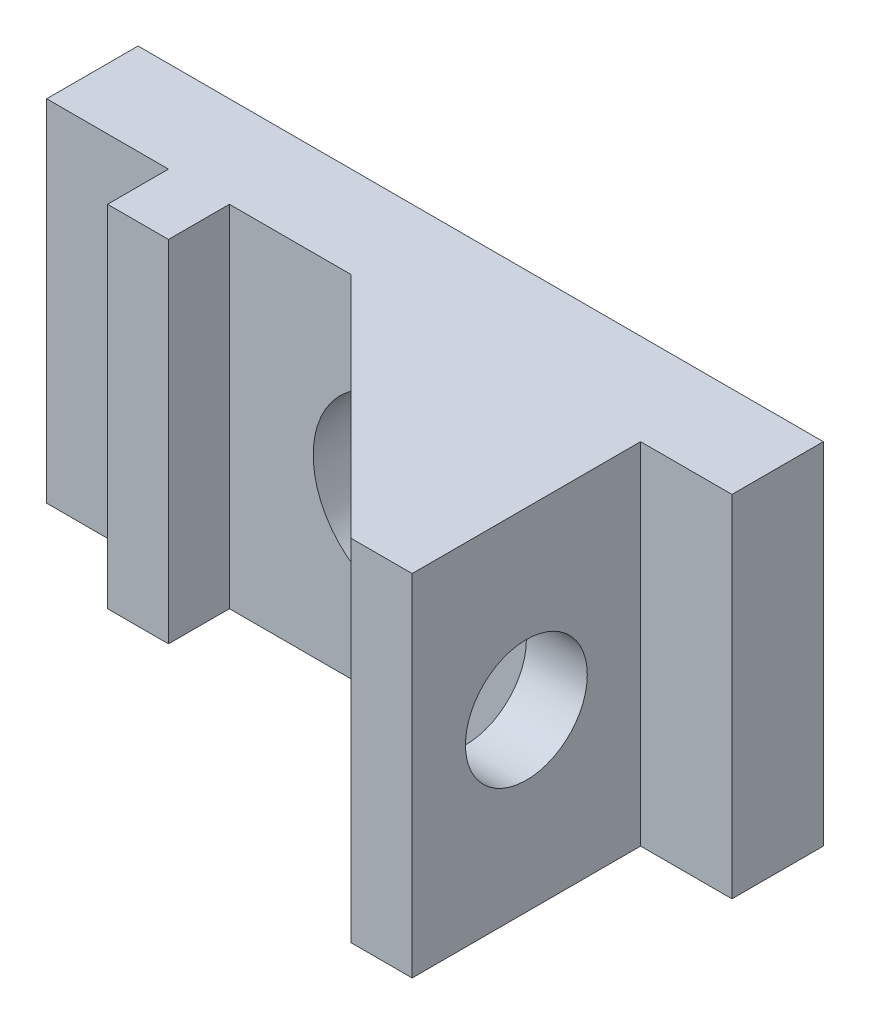
ISO-10303-21;
HEADER;
FILE_DESCRIPTION(('STEP AP214'),'2;1');
FILE_NAME('part.step','',(''),(''),'','','');
FILE_SCHEMA(('AUTOMOTIVE_DESIGN { 1 0 10303 214 1 1 1 1 }'));
ENDSEC;
DATA;
#1=APPLICATION_CONTEXT('core data for automotive mechanical design processes');
#2=APPLICATION_PROTOCOL_DEFINITION('international standard','automotive_design',2000,#1);
#3=PRODUCT_CONTEXT('',#1,'mechanical');
#4=PRODUCT('Part','Part','',(#3));
#5=PRODUCT_RELATED_PRODUCT_CATEGORY('part','',(#4));
#6=PRODUCT_DEFINITION_FORMATION('','',#4);
#7=PRODUCT_DEFINITION_CONTEXT('part definition',#1,'design');
#8=PRODUCT_DEFINITION('design','',#6,#7);
#9=PRODUCT_DEFINITION_SHAPE('','',#8);
#10=(LENGTH_UNIT() NAMED_UNIT(*) SI_UNIT(.MILLI.,.METRE.));
#11=(NAMED_UNIT(*) PLANE_ANGLE_UNIT() SI_UNIT($,.RADIAN.));
#12=(NAMED_UNIT(*) SI_UNIT($,.STERADIAN.) SOLID_ANGLE_UNIT());
#13=UNCERTAINTY_MEASURE_WITH_UNIT(LENGTH_MEASURE(1.E-05),#10,'distance_accuracy_value','');
#14=(GEOMETRIC_REPRESENTATION_CONTEXT(3) GLOBAL_UNCERTAINTY_ASSIGNED_CONTEXT((#13)) GLOBAL_UNIT_ASSIGNED_CONTEXT((#10,
#11,#12)) REPRESENTATION_CONTEXT('',''));
#15=CARTESIAN_POINT('',(0.,0.,0.));
#16=DIRECTION('',(0.,0.,1.));
#17=DIRECTION('',(1.,0.,0.));
#18=AXIS2_PLACEMENT_3D('',#15,#16,#17);
#19=CARTESIAN_POINT('',(12.5,23.,0.));
#20=DIRECTION('',(1.,0.,0.));
#21=DIRECTION('',(0.,0.,-1.));
#22=AXIS2_PLACEMENT_3D('',#19,#20,#21);
#23=PLANE('',#22);
#24=DIRECTION('',(0.,0.,-1.));
#25=VECTOR('',#24,1.);
#26=CARTESIAN_POINT('',(12.5,19.,10.5));
#27=LINE('',#26,#25);
#28=CARTESIAN_POINT('',(12.5,19.,10.5));
#29=VERTEX_POINT('',#28);
#30=CARTESIAN_POINT('',(12.5,19.,-4.5));
#31=VERTEX_POINT('',#30);
#32=EDGE_CURVE('E242',#29,#31,#27,.T.);
#33=ORIENTED_EDGE('',*,*,#32,.T.);
#34=DIRECTION('',(0.,-1.,0.));
#35=VECTOR('',#34,1.);
#36=CARTESIAN_POINT('',(12.5,23.,-4.5));
#37=LINE('',#36,#35);
#38=CARTESIAN_POINT('',(12.5,0.,-4.5));
#39=VERTEX_POINT('',#38);
#40=EDGE_CURVE('E198',#31,#39,#37,.T.);
#41=ORIENTED_EDGE('',*,*,#40,.T.);
#42=DIRECTION('',(0.,0.,1.));
#43=VECTOR('',#42,1.);
#44=CARTESIAN_POINT('',(12.5,0.,0.));
#45=LINE('',#44,#43);
#46=CARTESIAN_POINT('',(12.5,0.,10.5));
#47=VERTEX_POINT('',#46);
#48=EDGE_CURVE('E174',#39,#47,#45,.T.);
#49=ORIENTED_EDGE('',*,*,#48,.T.);
#50=DIRECTION('',(0.,-1.,0.));
#51=VECTOR('',#50,1.);
#52=CARTESIAN_POINT('',(12.5,23.,10.5));
#53=LINE('',#52,#51);
#54=EDGE_CURVE('E194',#29,#47,#53,.T.);
#55=ORIENTED_EDGE('',*,*,#54,.F.);
#56=EDGE_LOOP('',(#33,#41,#49,#55));
#57=FACE_BOUND('',#56,.T.);
#58=CARTESIAN_POINT('',(12.5,11.5,3.));
#59=DIRECTION('',(1.,0.,0.));
#60=DIRECTION('',(0.,0.,-1.));
#61=AXIS2_PLACEMENT_3D('',#58,#59,#60);
#62=CIRCLE('',#61,4.);
#63=CARTESIAN_POINT('',(12.5,11.5,-1.));
#64=VERTEX_POINT('',#63);
#65=EDGE_CURVE('E254',#64,#64,#62,.T.);
#66=ORIENTED_EDGE('',*,*,#65,.T.);
#67=EDGE_LOOP('',(#66));
#68=FACE_BOUND('',#67,.T.);
#69=ADVANCED_FACE('F37',(#57,#68),#23,.F.);
#70=CARTESIAN_POINT('',(16.5,23.,0.));
#71=DIRECTION('',(1.,0.,0.));
#72=DIRECTION('',(0.,0.,-1.));
#73=AXIS2_PLACEMENT_3D('',#70,#71,#72);
#74=PLANE('',#73);
#75=DIRECTION('',(0.,0.,1.));
#76=VECTOR('',#75,1.);
#77=CARTESIAN_POINT('',(16.5,0.,0.));
#78=LINE('',#77,#76);
#79=CARTESIAN_POINT('',(16.5,0.,-4.5));
#80=VERTEX_POINT('',#79);
#81=CARTESIAN_POINT('',(16.5,0.,10.5));
#82=VERTEX_POINT('',#81);
#83=EDGE_CURVE('E180',#80,#82,#78,.T.);
#84=ORIENTED_EDGE('',*,*,#83,.F.);
#85=DIRECTION('',(0.,-1.,0.));
#86=VECTOR('',#85,1.);
#87=CARTESIAN_POINT('',(16.5,23.,-4.5));
#88=LINE('',#87,#86);
#89=CARTESIAN_POINT('',(16.5,23.,-4.5));
#90=VERTEX_POINT('',#89);
#91=EDGE_CURVE('E150',#90,#80,#88,.T.);
#92=ORIENTED_EDGE('',*,*,#91,.F.);
#93=DIRECTION('',(0.,0.,1.));
#94=VECTOR('',#93,1.);
#95=CARTESIAN_POINT('',(16.5,23.,0.));
#96=LINE('',#95,#94);
#97=CARTESIAN_POINT('',(16.5,23.,10.5));
#98=VERTEX_POINT('',#97);
#99=EDGE_CURVE('E139',#90,#98,#96,.T.);
#100=ORIENTED_EDGE('',*,*,#99,.T.);
#101=DIRECTION('',(0.,-1.,0.));
#102=VECTOR('',#101,1.);
#103=CARTESIAN_POINT('',(16.5,23.,10.5));
#104=LINE('',#103,#102);
#105=EDGE_CURVE('E192',#98,#82,#104,.T.);
#106=ORIENTED_EDGE('',*,*,#105,.T.);
#107=EDGE_LOOP('',(#84,#92,#100,#106));
#108=FACE_BOUND('',#107,.T.);
#109=CARTESIAN_POINT('',(16.5,11.5,3.));
#110=DIRECTION('',(-1.,0.,0.));
#111=DIRECTION('',(0.,0.,1.));
#112=AXIS2_PLACEMENT_3D('',#109,#110,#111);
#113=CIRCLE('',#112,4.);
#114=CARTESIAN_POINT('',(16.5,11.5,-1.));
#115=VERTEX_POINT('',#114);
#116=EDGE_CURVE('E259',#115,#115,#113,.T.);
#117=ORIENTED_EDGE('',*,*,#116,.T.);
#118=EDGE_LOOP('',(#117));
#119=FACE_BOUND('',#118,.T.);
#120=ADVANCED_FACE('F263',(#108,#119),#74,.T.);
#121=CARTESIAN_POINT('',(-22.5,23.,0.));
#122=DIRECTION('',(1.,0.,0.));
#123=DIRECTION('',(0.,0.,-1.));
#124=AXIS2_PLACEMENT_3D('',#121,#122,#123);
#125=PLANE('',#124);
#126=DIRECTION('',(0.,0.,1.));
#127=VECTOR('',#126,1.);
#128=CARTESIAN_POINT('',(-22.5,0.,0.));
#129=LINE('',#128,#127);
#130=CARTESIAN_POINT('',(-22.5,0.,-10.5));
#131=VERTEX_POINT('',#130);
#132=CARTESIAN_POINT('',(-22.5,0.,-4.5));
#133=VERTEX_POINT('',#132);
#134=EDGE_CURVE('E159',#131,#133,#129,.T.);
#135=ORIENTED_EDGE('',*,*,#134,.T.);
#136=DIRECTION('',(0.,-1.,0.));
#137=VECTOR('',#136,1.);
#138=CARTESIAN_POINT('',(-22.5,23.,-4.5));
#139=LINE('',#138,#137);
#140=CARTESIAN_POINT('',(-22.5,23.,-4.5));
#141=VERTEX_POINT('',#140);
#142=EDGE_CURVE('E11',#141,#133,#139,.T.);
#143=ORIENTED_EDGE('',*,*,#142,.F.);
#144=DIRECTION('',(0.,0.,1.));
#145=VECTOR('',#144,1.);
#146=CARTESIAN_POINT('',(-22.5,23.,0.));
#147=LINE('',#146,#145);
#148=CARTESIAN_POINT('',(-22.5,23.,-10.5));
#149=VERTEX_POINT('',#148);
#150=EDGE_CURVE('E188',#149,#141,#147,.T.);
#151=ORIENTED_EDGE('',*,*,#150,.F.);
#152=DIRECTION('',(0.,-1.,0.));
#153=VECTOR('',#152,1.);
#154=CARTESIAN_POINT('',(-22.5,23.,-10.5));
#155=LINE('',#154,#153);
#156=EDGE_CURVE('E54',#149,#131,#155,.T.);
#157=ORIENTED_EDGE('',*,*,#156,.T.);
#158=EDGE_LOOP('',(#135,#143,#151,#157));
#159=FACE_BOUND('',#158,.T.);
#160=ADVANCED_FACE('F39',(#159),#125,.F.);
#161=CARTESIAN_POINT('',(0.,23.,-4.5));
#162=DIRECTION('',(0.,0.,-1.));
#163=DIRECTION('',(-1.,0.,0.));
#164=AXIS2_PLACEMENT_3D('',#161,#162,#163);
#165=PLANE('',#164);
#166=DIRECTION('',(1.,0.,0.));
#167=VECTOR('',#166,1.);
#168=CARTESIAN_POINT('',(0.,0.,-4.5));
#169=LINE('',#168,#167);
#170=CARTESIAN_POINT('',(-14.5,0.,-4.5));
#171=VERTEX_POINT('',#170);
#172=EDGE_CURVE('E161',#133,#171,#169,.T.);
#173=ORIENTED_EDGE('',*,*,#172,.T.);
#174=DIRECTION('',(0.,-1.,0.));
#175=VECTOR('',#174,1.);
#176=CARTESIAN_POINT('',(-14.5,23.,-4.5));
#177=LINE('',#176,#175);
#178=CARTESIAN_POINT('',(-14.5,23.,-4.5));
#179=VERTEX_POINT('',#178);
#180=EDGE_CURVE('E46',#179,#171,#177,.T.);
#181=ORIENTED_EDGE('',*,*,#180,.F.);
#182=DIRECTION('',(1.,0.,0.));
#183=VECTOR('',#182,1.);
#184=CARTESIAN_POINT('',(0.,23.,-4.5));
#185=LINE('',#184,#183);
#186=EDGE_CURVE('E105',#141,#179,#185,.T.);
#187=ORIENTED_EDGE('',*,*,#186,.F.);
#188=ORIENTED_EDGE('',*,*,#142,.T.);
#189=EDGE_LOOP('',(#173,#181,#187,#188));
#190=FACE_BOUND('',#189,.T.);
#191=ADVANCED_FACE('F296',(#190),#165,.F.);
#192=CARTESIAN_POINT('',(-14.5,23.,0.));
#193=DIRECTION('',(1.,0.,0.));
#194=DIRECTION('',(0.,0.,-1.));
#195=AXIS2_PLACEMENT_3D('',#192,#193,#194);
#196=PLANE('',#195);
#197=DIRECTION('',(0.,0.,1.));
#198=VECTOR('',#197,1.);
#199=CARTESIAN_POINT('',(-14.5,0.,0.));
#200=LINE('',#199,#198);
#201=CARTESIAN_POINT('',(-14.5,0.,-0.500000000000002));
#202=VERTEX_POINT('',#201);
#203=EDGE_CURVE('E164',#171,#202,#200,.T.);
#204=ORIENTED_EDGE('',*,*,#203,.T.);
#205=DIRECTION('',(0.,-1.,0.));
#206=VECTOR('',#205,1.);
#207=CARTESIAN_POINT('',(-14.5,23.,-0.500000000000002));
#208=LINE('',#207,#206);
#209=CARTESIAN_POINT('',(-14.5,23.,-0.500000000000002));
#210=VERTEX_POINT('',#209);
#211=EDGE_CURVE('E204',#210,#202,#208,.T.);
#212=ORIENTED_EDGE('',*,*,#211,.F.);
#213=DIRECTION('',(0.,0.,1.));
#214=VECTOR('',#213,1.);
#215=CARTESIAN_POINT('',(-14.5,23.,0.));
#216=LINE('',#215,#214);
#217=EDGE_CURVE('E211',#179,#210,#216,.T.);
#218=ORIENTED_EDGE('',*,*,#217,.F.);
#219=ORIENTED_EDGE('',*,*,#180,.T.);
#220=EDGE_LOOP('',(#204,#212,#218,#219));
#221=FACE_BOUND('',#220,.T.);
#222=ADVANCED_FACE('F209',(#221),#196,.F.);
#223=CARTESIAN_POINT('',(0.,23.,-0.500000000000004));
#224=DIRECTION('',(0.,0.,1.));
#225=DIRECTION('',(1.,0.,0.));
#226=AXIS2_PLACEMENT_3D('',#223,#224,#225);
#227=PLANE('',#226);
#228=DIRECTION('',(-1.,0.,0.));
#229=VECTOR('',#228,1.);
#230=CARTESIAN_POINT('',(0.,0.,-0.500000000000004));
#231=LINE('',#230,#229);
#232=CARTESIAN_POINT('',(-10.5,0.,-0.500000000000002));
#233=VERTEX_POINT('',#232);
#234=EDGE_CURVE('E168',#233,#202,#231,.T.);
#235=ORIENTED_EDGE('',*,*,#234,.F.);
#236=DIRECTION('',(0.,-1.,0.));
#237=VECTOR('',#236,1.);
#238=CARTESIAN_POINT('',(-10.5,23.,-0.500000000000002));
#239=LINE('',#238,#237);
#240=CARTESIAN_POINT('',(-10.5,23.,-0.500000000000002));
#241=VERTEX_POINT('',#240);
#242=EDGE_CURVE('E202',#241,#233,#239,.T.);
#243=ORIENTED_EDGE('',*,*,#242,.F.);
#244=DIRECTION('',(-1.,0.,0.));
#245=VECTOR('',#244,1.);
#246=CARTESIAN_POINT('',(0.,23.,-0.500000000000004));
#247=LINE('',#246,#245);
#248=EDGE_CURVE('E221',#241,#210,#247,.T.);
#249=ORIENTED_EDGE('',*,*,#248,.T.);
#250=ORIENTED_EDGE('',*,*,#211,.T.);
#251=EDGE_LOOP('',(#235,#243,#249,#250));
#252=FACE_BOUND('',#251,.T.);
#253=ADVANCED_FACE('F218',(#252),#227,.T.);
#254=CARTESIAN_POINT('',(-10.5,23.,0.));
#255=DIRECTION('',(1.,0.,0.));
#256=DIRECTION('',(0.,0.,-1.));
#257=AXIS2_PLACEMENT_3D('',#254,#255,#256);
#258=PLANE('',#257);
#259=DIRECTION('',(0.,0.,1.));
#260=VECTOR('',#259,1.);
#261=CARTESIAN_POINT('',(-10.5,0.,0.));
#262=LINE('',#261,#260);
#263=CARTESIAN_POINT('',(-10.5,0.,-4.5));
#264=VERTEX_POINT('',#263);
#265=EDGE_CURVE('E171',#264,#233,#262,.T.);
#266=ORIENTED_EDGE('',*,*,#265,.F.);
#267=DIRECTION('',(0.,-1.,0.));
#268=VECTOR('',#267,1.);
#269=CARTESIAN_POINT('',(-10.5,23.,-4.5));
#270=LINE('',#269,#268);
#271=CARTESIAN_POINT('',(-10.5,23.,-4.5));
#272=VERTEX_POINT('',#271);
#273=EDGE_CURVE('E200',#272,#264,#270,.T.);
#274=ORIENTED_EDGE('',*,*,#273,.F.);
#275=DIRECTION('',(0.,0.,1.));
#276=VECTOR('',#275,1.);
#277=CARTESIAN_POINT('',(-10.5,23.,0.));
#278=LINE('',#277,#276);
#279=EDGE_CURVE('E224',#272,#241,#278,.T.);
#280=ORIENTED_EDGE('',*,*,#279,.T.);
#281=ORIENTED_EDGE('',*,*,#242,.T.);
#282=EDGE_LOOP('',(#266,#274,#280,#281));
#283=FACE_BOUND('',#282,.T.);
#284=ADVANCED_FACE('F289',(#283),#258,.T.);
#285=CARTESIAN_POINT('',(1.,11.5,-4.5));
#286=DIRECTION('',(0.,0.,1.));
#287=DIRECTION('',(1.,0.,0.));
#288=AXIS2_PLACEMENT_3D('',#285,#286,#287);
#289=CIRCLE('',#288,6.);
#290=CARTESIAN_POINT('',(7.,11.5,-4.5));
#291=VERTEX_POINT('',#290);
#292=EDGE_CURVE('E251',#291,#291,#289,.T.);
#293=ORIENTED_EDGE('',*,*,#292,.F.);
#294=EDGE_LOOP('',(#293));
#295=FACE_BOUND('',#294,.T.);
#296=DIRECTION('',(-1.,0.,0.));
#297=VECTOR('',#296,1.);
#298=CARTESIAN_POINT('',(12.5,19.,-4.5));
#299=LINE('',#298,#297);
#300=CARTESIAN_POINT('',(-2.5,19.,-4.5));
#301=VERTEX_POINT('',#300);
#302=EDGE_CURVE('E246',#31,#301,#299,.T.);
#303=ORIENTED_EDGE('',*,*,#302,.T.);
#304=DIRECTION('',(0.,1.,0.));
#305=VECTOR('',#304,1.);
#306=CARTESIAN_POINT('',(-2.5,19.,-4.5));
#307=LINE('',#306,#305);
#308=CARTESIAN_POINT('',(-2.5,23.,-4.5));
#309=VERTEX_POINT('',#308);
#310=EDGE_CURVE('E162',#301,#309,#307,.T.);
#311=ORIENTED_EDGE('',*,*,#310,.T.);
#312=EDGE_CURVE('E142',#272,#309,#185,.T.);
#313=ORIENTED_EDGE('',*,*,#312,.F.);
#314=ORIENTED_EDGE('',*,*,#273,.T.);
#315=EDGE_CURVE('E165',#264,#39,#169,.T.);
#316=ORIENTED_EDGE('',*,*,#315,.T.);
#317=ORIENTED_EDGE('',*,*,#40,.F.);
#318=EDGE_LOOP('',(#303,#311,#313,#314,#316,#317));
#319=FACE_BOUND('',#318,.T.);
#320=ADVANCED_FACE('F292',(#295,#319),#165,.F.);
#321=CARTESIAN_POINT('',(0.,23.,10.5));
#322=DIRECTION('',(0.,0.,-1.));
#323=DIRECTION('',(-1.,0.,0.));
#324=AXIS2_PLACEMENT_3D('',#321,#322,#323);
#325=PLANE('',#324);
#326=DIRECTION('',(1.,0.,0.));
#327=VECTOR('',#326,1.);
#328=CARTESIAN_POINT('',(0.,0.,10.5));
#329=LINE('',#328,#327);
#330=EDGE_CURVE('E177',#47,#82,#329,.T.);
#331=ORIENTED_EDGE('',*,*,#330,.T.);
#332=ORIENTED_EDGE('',*,*,#105,.F.);
#333=DIRECTION('',(1.,0.,0.));
#334=VECTOR('',#333,1.);
#335=CARTESIAN_POINT('',(0.,23.,10.5));
#336=LINE('',#335,#334);
#337=CARTESIAN_POINT('',(12.5,23.,10.5));
#338=VERTEX_POINT('',#337);
#339=EDGE_CURVE('E228',#338,#98,#336,.T.);
#340=ORIENTED_EDGE('',*,*,#339,.F.);
#341=EDGE_CURVE('E195',#338,#29,#53,.T.);
#342=ORIENTED_EDGE('',*,*,#341,.T.);
#343=ORIENTED_EDGE('',*,*,#54,.T.);
#344=EDGE_LOOP('',(#331,#332,#340,#342,#343));
#345=FACE_BOUND('',#344,.T.);
#346=ADVANCED_FACE('F288',(#345),#325,.F.);
#347=CARTESIAN_POINT('',(22.5,0.,-4.5));
#348=VERTEX_POINT('',#347);
#349=EDGE_CURVE('E147',#80,#348,#169,.T.);
#350=ORIENTED_EDGE('',*,*,#349,.T.);
#351=DIRECTION('',(0.,-1.,0.));
#352=VECTOR('',#351,1.);
#353=CARTESIAN_POINT('',(22.5,23.,-4.5));
#354=LINE('',#353,#352);
#355=CARTESIAN_POINT('',(22.5,23.,-4.5));
#356=VERTEX_POINT('',#355);
#357=EDGE_CURVE('E144',#356,#348,#354,.T.);
#358=ORIENTED_EDGE('',*,*,#357,.F.);
#359=EDGE_CURVE('E131',#90,#356,#185,.T.);
#360=ORIENTED_EDGE('',*,*,#359,.F.);
#361=ORIENTED_EDGE('',*,*,#91,.T.);
#362=EDGE_LOOP('',(#350,#358,#360,#361));
#363=FACE_BOUND('',#362,.T.);
#364=ADVANCED_FACE('F145',(#363),#165,.F.);
#365=CARTESIAN_POINT('',(22.5,23.,0.));
#366=DIRECTION('',(1.,0.,0.));
#367=DIRECTION('',(0.,0.,-1.));
#368=AXIS2_PLACEMENT_3D('',#365,#366,#367);
#369=PLANE('',#368);
#370=DIRECTION('',(0.,0.,1.));
#371=VECTOR('',#370,1.);
#372=CARTESIAN_POINT('',(22.5,0.,0.));
#373=LINE('',#372,#371);
#374=CARTESIAN_POINT('',(22.5,0.,-10.5));
#375=VERTEX_POINT('',#374);
#376=EDGE_CURVE('E183',#375,#348,#373,.T.);
#377=ORIENTED_EDGE('',*,*,#376,.F.);
#378=DIRECTION('',(0.,-1.,0.));
#379=VECTOR('',#378,1.);
#380=CARTESIAN_POINT('',(22.5,23.,-10.5));
#381=LINE('',#380,#379);
#382=CARTESIAN_POINT('',(22.5,23.,-10.5));
#383=VERTEX_POINT('',#382);
#384=EDGE_CURVE('E93',#383,#375,#381,.T.);
#385=ORIENTED_EDGE('',*,*,#384,.F.);
#386=DIRECTION('',(0.,0.,1.));
#387=VECTOR('',#386,1.);
#388=CARTESIAN_POINT('',(22.5,23.,0.));
#389=LINE('',#388,#387);
#390=EDGE_CURVE('E137',#383,#356,#389,.T.);
#391=ORIENTED_EDGE('',*,*,#390,.T.);
#392=ORIENTED_EDGE('',*,*,#357,.T.);
#393=EDGE_LOOP('',(#377,#385,#391,#392));
#394=FACE_BOUND('',#393,.T.);
#395=ADVANCED_FACE('F152',(#394),#369,.T.);
#396=CARTESIAN_POINT('',(0.,23.,-10.5));
#397=DIRECTION('',(0.,0.,-1.));
#398=DIRECTION('',(-1.,0.,0.));
#399=AXIS2_PLACEMENT_3D('',#396,#397,#398);
#400=PLANE('',#399);
#401=CARTESIAN_POINT('',(1.,11.5,-10.5));
#402=DIRECTION('',(0.,0.,1.));
#403=DIRECTION('',(1.,0.,0.));
#404=AXIS2_PLACEMENT_3D('',#401,#402,#403);
#405=CIRCLE('',#404,6.);
#406=CARTESIAN_POINT('',(7.,11.5,-10.5));
#407=VERTEX_POINT('',#406);
#408=EDGE_CURVE('E243',#407,#407,#405,.T.);
#409=ORIENTED_EDGE('',*,*,#408,.T.);
#410=EDGE_LOOP('',(#409));
#411=FACE_BOUND('',#410,.T.);
#412=DIRECTION('',(1.,0.,0.));
#413=VECTOR('',#412,1.);
#414=CARTESIAN_POINT('',(0.,0.,-10.5));
#415=LINE('',#414,#413);
#416=EDGE_CURVE('E185',#131,#375,#415,.T.);
#417=ORIENTED_EDGE('',*,*,#416,.F.);
#418=ORIENTED_EDGE('',*,*,#156,.F.);
#419=DIRECTION('',(1.,0.,0.));
#420=VECTOR('',#419,1.);
#421=CARTESIAN_POINT('',(0.,23.,-10.5));
#422=LINE('',#421,#420);
#423=EDGE_CURVE('E153',#149,#383,#422,.T.);
#424=ORIENTED_EDGE('',*,*,#423,.T.);
#425=ORIENTED_EDGE('',*,*,#384,.T.);
#426=EDGE_LOOP('',(#417,#418,#424,#425));
#427=FACE_BOUND('',#426,.T.);
#428=ADVANCED_FACE('F312',(#411,#427),#400,.T.);
#429=CARTESIAN_POINT('',(0.,23.,0.));
#430=DIRECTION('',(0.,1.,0.));
#431=DIRECTION('',(0.,0.,1.));
#432=AXIS2_PLACEMENT_3D('',#429,#430,#431);
#433=PLANE('',#432);
#434=DIRECTION('',(0.707106781186548,0.,0.707106781186547));
#435=VECTOR('',#434,1.);
#436=CARTESIAN_POINT('',(12.5,23.,10.5));
#437=LINE('',#436,#435);
#438=EDGE_CURVE('E240',#309,#338,#437,.T.);
#439=ORIENTED_EDGE('',*,*,#438,.T.);
#440=ORIENTED_EDGE('',*,*,#339,.T.);
#441=ORIENTED_EDGE('',*,*,#99,.F.);
#442=ORIENTED_EDGE('',*,*,#359,.T.);
#443=ORIENTED_EDGE('',*,*,#390,.F.);
#444=ORIENTED_EDGE('',*,*,#423,.F.);
#445=ORIENTED_EDGE('',*,*,#150,.T.);
#446=ORIENTED_EDGE('',*,*,#186,.T.);
#447=ORIENTED_EDGE('',*,*,#217,.T.);
#448=ORIENTED_EDGE('',*,*,#248,.F.);
#449=ORIENTED_EDGE('',*,*,#279,.F.);
#450=ORIENTED_EDGE('',*,*,#312,.T.);
#451=EDGE_LOOP('',(#439,#440,#441,#442,#443,#444,#445,#446,#447,#448,#449,#450));
#452=FACE_BOUND('',#451,.T.);
#453=ADVANCED_FACE('F134',(#452),#433,.T.);
#454=CARTESIAN_POINT('',(0.,0.,0.));
#455=DIRECTION('',(0.,1.,0.));
#456=DIRECTION('',(0.,0.,1.));
#457=AXIS2_PLACEMENT_3D('',#454,#455,#456);
#458=PLANE('',#457);
#459=ORIENTED_EDGE('',*,*,#134,.F.);
#460=ORIENTED_EDGE('',*,*,#416,.T.);
#461=ORIENTED_EDGE('',*,*,#376,.T.);
#462=ORIENTED_EDGE('',*,*,#349,.F.);
#463=ORIENTED_EDGE('',*,*,#83,.T.);
#464=ORIENTED_EDGE('',*,*,#330,.F.);
#465=ORIENTED_EDGE('',*,*,#48,.F.);
#466=ORIENTED_EDGE('',*,*,#315,.F.);
#467=ORIENTED_EDGE('',*,*,#265,.T.);
#468=ORIENTED_EDGE('',*,*,#234,.T.);
#469=ORIENTED_EDGE('',*,*,#203,.F.);
#470=ORIENTED_EDGE('',*,*,#172,.F.);
#471=EDGE_LOOP('',(#459,#460,#461,#462,#463,#464,#465,#466,#467,#468,#469,#470));
#472=FACE_BOUND('',#471,.T.);
#473=ADVANCED_FACE('F213',(#472),#458,.F.);
#474=CARTESIAN_POINT('',(12.5,19.,10.5));
#475=DIRECTION('',(-0.707106781186547,0.,0.707106781186548));
#476=DIRECTION('',(0.707106781186548,0.,0.707106781186547));
#477=AXIS2_PLACEMENT_3D('',#474,#475,#476);
#478=PLANE('',#477);
#479=ORIENTED_EDGE('',*,*,#438,.F.);
#480=ORIENTED_EDGE('',*,*,#310,.F.);
#481=DIRECTION('',(0.707106781186548,0.,0.707106781186547));
#482=VECTOR('',#481,1.);
#483=CARTESIAN_POINT('',(12.5,19.,10.5));
#484=LINE('',#483,#482);
#485=EDGE_CURVE('E239',#301,#29,#484,.T.);
#486=ORIENTED_EDGE('',*,*,#485,.T.);
#487=ORIENTED_EDGE('',*,*,#341,.F.);
#488=EDGE_LOOP('',(#479,#480,#486,#487));
#489=FACE_BOUND('',#488,.T.);
#490=ADVANCED_FACE('F335',(#489),#478,.T.);
#491=CARTESIAN_POINT('',(0.,19.,0.));
#492=DIRECTION('',(0.,1.,0.));
#493=DIRECTION('',(0.,0.,1.));
#494=AXIS2_PLACEMENT_3D('',#491,#492,#493);
#495=PLANE('',#494);
#496=ORIENTED_EDGE('',*,*,#32,.F.);
#497=ORIENTED_EDGE('',*,*,#485,.F.);
#498=ORIENTED_EDGE('',*,*,#302,.F.);
#499=EDGE_LOOP('',(#496,#497,#498));
#500=FACE_BOUND('',#499,.T.);
#501=ADVANCED_FACE('F273',(#500),#495,.F.);
#502=CARTESIAN_POINT('',(1.,11.5,-10.5));
#503=DIRECTION('',(0.,0.,1.));
#504=DIRECTION('',(1.,0.,0.));
#505=AXIS2_PLACEMENT_3D('',#502,#503,#504);
#506=CYLINDRICAL_SURFACE('',#505,6.);
#507=ORIENTED_EDGE('',*,*,#408,.F.);
#508=EDGE_LOOP('',(#507));
#509=FACE_BOUND('',#508,.T.);
#510=ORIENTED_EDGE('',*,*,#292,.T.);
#511=EDGE_LOOP('',(#510));
#512=FACE_BOUND('',#511,.T.);
#513=ADVANCED_FACE('F267',(#509,#512),#506,.F.);
#514=CARTESIAN_POINT('',(1.18629150101523,11.5,3.));
#515=DIRECTION('',(1.,0.,0.));
#516=DIRECTION('',(0.,0.,-1.));
#517=AXIS2_PLACEMENT_3D('',#514,#515,#516);
#518=CYLINDRICAL_SURFACE('',#517,4.);
#519=CARTESIAN_POINT('',(12.5,11.5,-1.));
#520=CARTESIAN_POINT('',(12.5416666666667,11.5,-1.));
#521=CARTESIAN_POINT('',(12.5833333333333,11.5,-1.));
#522=CARTESIAN_POINT('',(12.6666666666667,11.5,-1.));
#523=CARTESIAN_POINT('',(12.7083333333333,11.5,-1.));
#524=CARTESIAN_POINT('',(12.7916666666667,11.5,-1.));
#525=CARTESIAN_POINT('',(12.8333333333333,11.5,-1.));
#526=CARTESIAN_POINT('',(12.9166666666667,11.5,-1.));
#527=CARTESIAN_POINT('',(12.9583333333333,11.5,-1.));
#528=CARTESIAN_POINT('',(13.0416666666667,11.5,-1.));
#529=CARTESIAN_POINT('',(13.0833333333333,11.5,-1.));
#530=CARTESIAN_POINT('',(13.1666666666667,11.5,-1.));
#531=CARTESIAN_POINT('',(13.2083333333333,11.5,-1.));
#532=CARTESIAN_POINT('',(13.2916666666667,11.5,-1.));
#533=CARTESIAN_POINT('',(13.3333333333333,11.5,-1.));
#534=CARTESIAN_POINT('',(13.4166666666667,11.5,-1.));
#535=CARTESIAN_POINT('',(13.4583333333333,11.5,-1.));
#536=CARTESIAN_POINT('',(13.5416666666667,11.5,-1.));
#537=CARTESIAN_POINT('',(13.5833333333333,11.5,-1.));
#538=CARTESIAN_POINT('',(13.6666666666667,11.5,-1.));
#539=CARTESIAN_POINT('',(13.7083333333333,11.5,-1.));
#540=CARTESIAN_POINT('',(13.7916666666667,11.5,-1.));
#541=CARTESIAN_POINT('',(13.8333333333333,11.5,-1.));
#542=CARTESIAN_POINT('',(13.9166666666667,11.5,-1.));
#543=CARTESIAN_POINT('',(13.9583333333333,11.5,-1.));
#544=CARTESIAN_POINT('',(14.0416666666667,11.5,-1.));
#545=CARTESIAN_POINT('',(14.0833333333333,11.5,-1.));
#546=CARTESIAN_POINT('',(14.1666666666667,11.5,-1.));
#547=CARTESIAN_POINT('',(14.2083333333333,11.5,-1.));
#548=CARTESIAN_POINT('',(14.2916666666667,11.5,-1.));
#549=CARTESIAN_POINT('',(14.3333333333333,11.5,-1.));
#550=CARTESIAN_POINT('',(14.4166666666667,11.5,-1.));
#551=CARTESIAN_POINT('',(14.4583333333333,11.5,-1.));
#552=CARTESIAN_POINT('',(14.5416666666667,11.5,-1.));
#553=CARTESIAN_POINT('',(14.5833333333333,11.5,-1.));
#554=CARTESIAN_POINT('',(14.6666666666667,11.5,-1.));
#555=CARTESIAN_POINT('',(14.7083333333333,11.5,-1.));
#556=CARTESIAN_POINT('',(14.7916666666667,11.5,-1.));
#557=CARTESIAN_POINT('',(14.8333333333333,11.5,-1.));
#558=CARTESIAN_POINT('',(14.9166666666667,11.5,-1.));
#559=CARTESIAN_POINT('',(14.9583333333333,11.5,-1.));
#560=CARTESIAN_POINT('',(15.0416666666667,11.5,-1.));
#561=CARTESIAN_POINT('',(15.0833333333333,11.5,-1.));
#562=CARTESIAN_POINT('',(15.1666666666667,11.5,-1.));
#563=CARTESIAN_POINT('',(15.2083333333333,11.5,-1.));
#564=CARTESIAN_POINT('',(15.2916666666667,11.5,-1.));
#565=CARTESIAN_POINT('',(15.3333333333333,11.5,-1.));
#566=CARTESIAN_POINT('',(15.4166666666667,11.5,-1.));
#567=CARTESIAN_POINT('',(15.4583333333333,11.5,-1.));
#568=CARTESIAN_POINT('',(15.5416666666667,11.5,-1.));
#569=CARTESIAN_POINT('',(15.5833333333333,11.5,-1.));
#570=CARTESIAN_POINT('',(15.6666666666667,11.5,-1.));
#571=CARTESIAN_POINT('',(15.7083333333333,11.5,-1.));
#572=CARTESIAN_POINT('',(15.7916666666667,11.5,-1.));
#573=CARTESIAN_POINT('',(15.8333333333333,11.5,-1.));
#574=CARTESIAN_POINT('',(15.9166666666667,11.5,-1.));
#575=CARTESIAN_POINT('',(15.9583333333333,11.5,-1.));
#576=CARTESIAN_POINT('',(16.0416666666667,11.5,-1.));
#577=CARTESIAN_POINT('',(16.0833333333333,11.5,-1.));
#578=CARTESIAN_POINT('',(16.1666666666667,11.5,-1.));
#579=CARTESIAN_POINT('',(16.2083333333333,11.5,-1.));
#580=CARTESIAN_POINT('',(16.2916666666667,11.5,-1.));
#581=CARTESIAN_POINT('',(16.3333333333333,11.5,-1.));
#582=CARTESIAN_POINT('',(16.4166666666667,11.5,-1.));
#583=CARTESIAN_POINT('',(16.4583333333333,11.5,-1.));
#584=CARTESIAN_POINT('',(16.5,11.5,-1.));
#585=B_SPLINE_CURVE_WITH_KNOTS('',3,(#519,#520,#521,#522,#523,#524,#525,#526,#527,#528,#529,
#530,#531,#532,#533,#534,#535,#536,#537,#538,#539,#540,#541,#542,#543,#544,#545,#546,#547,#548,
#549,#550,#551,#552,#553,#554,#555,#556,#557,#558,#559,#560,#561,#562,#563,#564,#565,#566,#567,
#568,#569,#570,#571,#572,#573,#574,#575,#576,#577,#578,#579,#580,#581,#582,#583,#584),
.UNSPECIFIED.,.F.,.F.,(4,2,2,2,2,2,2,2,2,2,2,2,2,2,2,2,2,2,2,2,2,2,2,2,2,2,2,2,2,2,2,2,4),(0.,
0.125,0.25,0.375,0.5,0.625000000000001,0.750000000000001,0.875000000000001,1.,1.125,1.25,1.375,
1.5,1.625,1.75,1.875,2.,2.125,2.25,2.375,2.5,2.625,2.75,2.875,3.,3.125,3.25,3.375,3.5,3.625,
3.75,3.875,4.),.UNSPECIFIED.);
#586=EDGE_CURVE('BSEAM265',#64,#115,#585,.T.);
#587=ORIENTED_EDGE('',*,*,#65,.F.);
#588=ORIENTED_EDGE('',*,*,#116,.F.);
#589=ORIENTED_EDGE('',*,*,#586,.T.);
#590=ORIENTED_EDGE('',*,*,#586,.F.);
#591=EDGE_LOOP('',(#587,#589,#588,#590));
#592=FACE_BOUND('',#591,.T.);
#593=ADVANCED_FACE('F265',(#592),#518,.F.);
#594=CLOSED_SHELL('',(#69,#120,#160,#191,#222,#253,#284,#320,#346,#364,#395,#428,#453,#473,#490,
#501,#513,#593));
#595=MANIFOLD_SOLID_BREP('B2',#594);
#596=ADVANCED_BREP_SHAPE_REPRESENTATION('',(#18,#595),#14);
#597=SHAPE_DEFINITION_REPRESENTATION(#9,#596);
ENDSEC;
END-ISO-10303-21;
